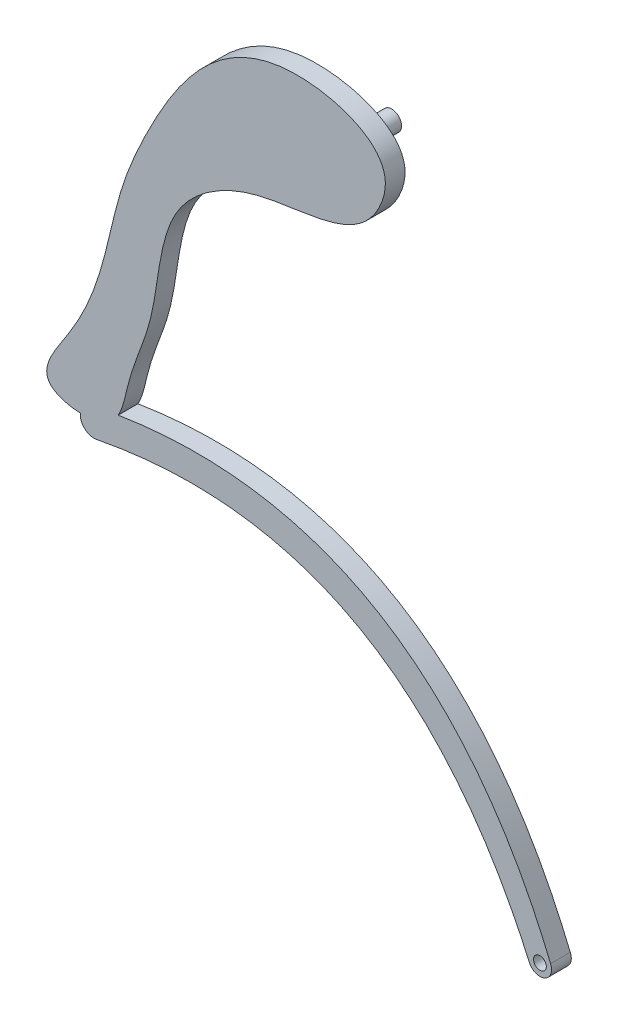
ISO-10303-21;
HEADER;
FILE_DESCRIPTION(('STEP AP214'),'2;1');
FILE_NAME('part.step','',(''),(''),'','','');
FILE_SCHEMA(('AUTOMOTIVE_DESIGN { 1 0 10303 214 1 1 1 1 }'));
ENDSEC;
DATA;
#1=APPLICATION_CONTEXT('core data for automotive mechanical design processes');
#2=APPLICATION_PROTOCOL_DEFINITION('international standard','automotive_design',2000,#1);
#3=PRODUCT_CONTEXT('',#1,'mechanical');
#4=PRODUCT('Part','Part','',(#3));
#5=PRODUCT_RELATED_PRODUCT_CATEGORY('part','',(#4));
#6=PRODUCT_DEFINITION_FORMATION('','',#4);
#7=PRODUCT_DEFINITION_CONTEXT('part definition',#1,'design');
#8=PRODUCT_DEFINITION('design','',#6,#7);
#9=PRODUCT_DEFINITION_SHAPE('','',#8);
#10=(LENGTH_UNIT() NAMED_UNIT(*) SI_UNIT(.MILLI.,.METRE.));
#11=(NAMED_UNIT(*) PLANE_ANGLE_UNIT() SI_UNIT($,.RADIAN.));
#12=(NAMED_UNIT(*) SI_UNIT($,.STERADIAN.) SOLID_ANGLE_UNIT());
#13=UNCERTAINTY_MEASURE_WITH_UNIT(LENGTH_MEASURE(1.E-05),#10,'distance_accuracy_value','');
#14=(GEOMETRIC_REPRESENTATION_CONTEXT(3) GLOBAL_UNCERTAINTY_ASSIGNED_CONTEXT((#13)) GLOBAL_UNIT_ASSIGNED_CONTEXT((#10,
#11,#12)) REPRESENTATION_CONTEXT('',''));
#15=CARTESIAN_POINT('',(0.,0.,0.));
#16=DIRECTION('',(0.,0.,1.));
#17=DIRECTION('',(1.,0.,0.));
#18=AXIS2_PLACEMENT_3D('',#15,#16,#17);
#19=CARTESIAN_POINT('',(-342.104002749214,136.783818050097,7.48502011703777));
#20=CARTESIAN_POINT('',(-342.805579458577,136.735017879965,7.48502011703777));
#21=CARTESIAN_POINT('',(-343.350555461004,135.936154868596,7.48502011703777));
#22=CARTESIAN_POINT('',(-343.929440164469,134.651457769446,7.48502011703777));
#23=CARTESIAN_POINT('',(-343.959922184164,133.777952281904,7.48502011703777));
#24=CARTESIAN_POINT('',(-344.782327143898,132.73901267866,7.48502011703777));
#25=CARTESIAN_POINT('',(-343.813368996402,132.639933395947,7.48502011703777));
#26=CARTESIAN_POINT('',(-343.727540206947,133.310775924254,7.48502011703777));
#27=CARTESIAN_POINT('',(-343.400926719451,133.968060059399,7.48502011703777));
#28=CARTESIAN_POINT('',(-343.424769057702,134.992162386568,7.48502011703777));
#29=CARTESIAN_POINT('',(-342.396848795902,135.684316393713,7.48502011703777));
#30=CARTESIAN_POINT('',(-341.342866284186,135.559973064465,7.48502011703777));
#31=CARTESIAN_POINT('',(-340.941154326409,136.591582614292,7.48502011703777));
#32=CARTESIAN_POINT('',(-341.679360406377,136.813355260069,7.48502011703777));
#33=CARTESIAN_POINT('',(-342.104002749214,136.783818050097,7.48502011703777));
#34=B_SPLINE_CURVE_WITH_KNOTS('',3,(#19,#20,#21,#22,#23,#24,#25,#26,#27,#28,#29,#30,#31,#32,
#33),.UNSPECIFIED.,.T.,.F.,(4,1,1,1,1,1,1,1,1,1,1,1,4),(0.,0.159177830000064,0.222571778534528,
0.367294655292266,0.418107249673309,0.471783736478388,0.513301840180607,0.572978205833702,
0.671765174880242,0.755128356265424,0.868017243335042,0.90365465991559,1.),.UNSPECIFIED.);
#35=DIRECTION('',(0.,0.,-1.));
#36=VECTOR('',#35,1.);
#37=SURFACE_OF_LINEAR_EXTRUSION('',#34,#36);
#38=DIRECTION('',(0.,0.,1.));
#39=VECTOR('',#38,1.);
#40=CARTESIAN_POINT('',(-343.821376877826,132.888231800464,7.38502011703777));
#41=LINE('',#40,#39);
#42=CARTESIAN_POINT('',(-343.821376877866,132.888231800457,7.28502011703778));
#43=VERTEX_POINT('',#42);
#44=CARTESIAN_POINT('',(-343.821376877866,132.888231800457,7.48502011703777));
#45=VERTEX_POINT('',#44);
#46=EDGE_CURVE('E61',#43,#45,#41,.T.);
#47=ORIENTED_EDGE('',*,*,#46,.F.);
#48=CARTESIAN_POINT('',(-342.104002749214,136.783818050097,7.28502011703778));
#49=CARTESIAN_POINT('',(-342.805579458577,136.735017879965,7.28502011703778));
#50=CARTESIAN_POINT('',(-343.350555461004,135.936154868596,7.28502011703778));
#51=CARTESIAN_POINT('',(-343.929440164469,134.651457769446,7.28502011703778));
#52=CARTESIAN_POINT('',(-343.959922184164,133.777952281904,7.28502011703778));
#53=CARTESIAN_POINT('',(-344.782327143898,132.73901267866,7.28502011703778));
#54=CARTESIAN_POINT('',(-343.813368996402,132.639933395947,7.28502011703778));
#55=CARTESIAN_POINT('',(-343.727540206947,133.310775924254,7.28502011703778));
#56=CARTESIAN_POINT('',(-343.400926719451,133.968060059399,7.28502011703778));
#57=CARTESIAN_POINT('',(-343.424769057702,134.992162386568,7.28502011703778));
#58=CARTESIAN_POINT('',(-342.396848795902,135.684316393713,7.28502011703778));
#59=CARTESIAN_POINT('',(-341.342866284186,135.559973064465,7.28502011703778));
#60=CARTESIAN_POINT('',(-340.941154326409,136.591582614292,7.28502011703778));
#61=CARTESIAN_POINT('',(-341.679360406377,136.813355260069,7.28502011703778));
#62=CARTESIAN_POINT('',(-342.104002749214,136.783818050097,7.28502011703778));
#63=B_SPLINE_CURVE_WITH_KNOTS('',3,(#48,#49,#50,#51,#52,#53,#54,#55,#56,#57,#58,#59,#60,#61,
#62),.UNSPECIFIED.,.T.,.F.,(4,1,1,1,1,1,1,1,1,1,1,1,4),(0.,0.159177830000064,0.222571778534528,
0.367294655292266,0.418107249673309,0.471783736478388,0.513301840180607,0.572978205833702,
0.671765174880242,0.755128356265424,0.868017243335042,0.90365465991559,1.),.UNSPECIFIED.);
#64=CARTESIAN_POINT('',(-344.205785310443,132.714431609231,7.28502011703778));
#65=VERTEX_POINT('',#64);
#66=EDGE_CURVE('E180',#43,#65,#63,.T.);
#67=ORIENTED_EDGE('',*,*,#66,.T.);
#68=DIRECTION('',(0.,0.,-1.));
#69=VECTOR('',#68,1.);
#70=CARTESIAN_POINT('',(-344.205785310443,132.714431609231,7.48502011703777));
#71=LINE('',#70,#69);
#72=CARTESIAN_POINT('',(-344.205785310443,132.714431609231,7.48502011703777));
#73=VERTEX_POINT('',#72);
#74=EDGE_CURVE('E133',#65,#73,#71,.F.);
#75=ORIENTED_EDGE('',*,*,#74,.T.);
#76=EDGE_CURVE('E46',#45,#73,#34,.T.);
#77=ORIENTED_EDGE('',*,*,#76,.F.);
#78=EDGE_LOOP('',(#47,#67,#75,#77));
#79=FACE_BOUND('',#78,.T.);
#80=ADVANCED_FACE('F37',(#79),#37,.F.);
#81=CARTESIAN_POINT('',(-343.757571402426,133.056662154668,7.48502011703777));
#82=DIRECTION('',(0.,0.,-1.));
#83=DIRECTION('',(-1.,0.,0.));
#84=AXIS2_PLACEMENT_3D('',#81,#82,#83);
#85=PLANE('',#84);
#86=CARTESIAN_POINT('',(-339.539284354937,130.211686137803,7.48502011703777));
#87=DIRECTION('',(0.,0.,1.));
#88=DIRECTION('',(1.,0.,0.));
#89=AXIS2_PLACEMENT_3D('',#86,#87,#88);
#90=CIRCLE('',#89,0.0648024293380558);
#91=CARTESIAN_POINT('',(-339.474481925599,130.211686137803,7.48502011703777));
#92=VERTEX_POINT('',#91);
#93=EDGE_CURVE('E203',#92,#92,#90,.T.);
#94=ORIENTED_EDGE('',*,*,#93,.F.);
#95=EDGE_LOOP('',(#94));
#96=FACE_BOUND('',#95,.T.);
#97=ORIENTED_EDGE('',*,*,#76,.T.);
#98=CARTESIAN_POINT('',(-344.066915578554,132.701169319651,7.48502011703777));
#99=DIRECTION('',(0.,0.,1.));
#100=DIRECTION('',(1.,0.,0.));
#101=AXIS2_PLACEMENT_3D('',#98,#99,#100);
#102=CIRCLE('',#101,0.139501579775661);
#103=CARTESIAN_POINT('',(-344.038536425968,132.564584860585,7.48502011703777));
#104=VERTEX_POINT('',#103);
#105=EDGE_CURVE('E53',#73,#104,#102,.T.);
#106=ORIENTED_EDGE('',*,*,#105,.T.);
#107=CARTESIAN_POINT('',(-344.038536425968,132.564584860585,7.48502011703777));
#108=CARTESIAN_POINT('',(-341.996789547392,132.960949860655,7.48502011703777));
#109=CARTESIAN_POINT('',(-340.533121693645,132.160648743439,7.48502011703777));
#110=CARTESIAN_POINT('',(-339.647532864715,130.163681508908,7.48502011703777));
#111=B_SPLINE_CURVE_WITH_KNOTS('',3,(#107,#108,#109,#110),.UNSPECIFIED.,.F.,.F.,(4,4),(0.,
0.973375657681869),.UNSPECIFIED.);
#112=CARTESIAN_POINT('',(-339.647532864715,130.163681508908,7.48502011703777));
#113=VERTEX_POINT('',#112);
#114=EDGE_CURVE('E112',#104,#113,#111,.T.);
#115=ORIENTED_EDGE('',*,*,#114,.T.);
#116=CARTESIAN_POINT('',(-339.539284354937,130.211686137803,7.48502011703777));
#117=DIRECTION('',(0.,0.,1.));
#118=DIRECTION('',(1.,0.,0.));
#119=AXIS2_PLACEMENT_3D('',#116,#117,#118);
#120=CIRCLE('',#119,0.118415304181697);
#121=CARTESIAN_POINT('',(-339.431035845159,130.259690766698,7.48502011703777));
#122=VERTEX_POINT('',#121);
#123=EDGE_CURVE('E104',#113,#122,#120,.T.);
#124=ORIENTED_EDGE('',*,*,#123,.T.);
#125=CARTESIAN_POINT('',(-344.095294731139,132.837753778718,7.48502011703777));
#126=CARTESIAN_POINT('',(-341.932162729999,133.287203544397,7.48502011703777));
#127=CARTESIAN_POINT('',(-340.331358608681,132.44262208393,7.48502011703777));
#128=CARTESIAN_POINT('',(-339.431035845159,130.259690766698,7.48502011703777));
#129=B_SPLINE_CURVE_WITH_KNOTS('',3,(#125,#126,#127,#128),.UNSPECIFIED.,.F.,.F.,(4,4),(0.,1.),.UNSPECIFIED.);
#130=EDGE_CURVE('E124',#45,#122,#129,.T.);
#131=ORIENTED_EDGE('',*,*,#130,.F.);
#132=EDGE_LOOP('',(#97,#106,#115,#124,#131));
#133=FACE_BOUND('',#132,.T.);
#134=ADVANCED_FACE('F165',(#96,#133),#85,.F.);
#135=CARTESIAN_POINT('',(-343.757571402426,133.056662154668,7.28502011703778));
#136=DIRECTION('',(0.,0.,-1.));
#137=DIRECTION('',(-1.,0.,0.));
#138=AXIS2_PLACEMENT_3D('',#135,#136,#137);
#139=PLANE('',#138);
#140=CARTESIAN_POINT('',(-339.539284354937,130.211686137803,7.28502011703778));
#141=DIRECTION('',(0.,0.,-1.));
#142=DIRECTION('',(-1.,0.,0.));
#143=AXIS2_PLACEMENT_3D('',#140,#141,#142);
#144=CIRCLE('',#143,0.0648024293380558);
#145=CARTESIAN_POINT('',(-339.604086784275,130.211686137803,7.28502011703778));
#146=VERTEX_POINT('',#145);
#147=EDGE_CURVE('E41',#146,#146,#144,.T.);
#148=ORIENTED_EDGE('',*,*,#147,.F.);
#149=EDGE_LOOP('',(#148));
#150=FACE_BOUND('',#149,.T.);
#151=ORIENTED_EDGE('',*,*,#66,.F.);
#152=CARTESIAN_POINT('',(-344.095294731139,132.837753778718,7.28502011703778));
#153=CARTESIAN_POINT('',(-341.932162729999,133.287203544397,7.28502011703778));
#154=CARTESIAN_POINT('',(-340.331358608681,132.44262208393,7.28502011703778));
#155=CARTESIAN_POINT('',(-339.431035845159,130.259690766698,7.28502011703778));
#156=B_SPLINE_CURVE_WITH_KNOTS('',3,(#152,#153,#154,#155),.UNSPECIFIED.,.F.,.F.,(4,4),(0.,1.),.UNSPECIFIED.);
#157=CARTESIAN_POINT('',(-339.431035845159,130.259690766698,7.28502011703778));
#158=VERTEX_POINT('',#157);
#159=EDGE_CURVE('E94',#43,#158,#156,.T.);
#160=ORIENTED_EDGE('',*,*,#159,.T.);
#161=CARTESIAN_POINT('',(-339.539284354937,130.211686137803,7.28502011703778));
#162=DIRECTION('',(0.,0.,-1.));
#163=DIRECTION('',(-1.,0.,0.));
#164=AXIS2_PLACEMENT_3D('',#161,#162,#163);
#165=CIRCLE('',#164,0.118415304181697);
#166=CARTESIAN_POINT('',(-339.647532864715,130.163681508908,7.28502011703778));
#167=VERTEX_POINT('',#166);
#168=EDGE_CURVE('E85',#167,#158,#165,.F.);
#169=ORIENTED_EDGE('',*,*,#168,.F.);
#170=CARTESIAN_POINT('',(-344.038536425968,132.564584860585,7.28502011703778));
#171=CARTESIAN_POINT('',(-341.996789547392,132.960949860655,7.28502011703778));
#172=CARTESIAN_POINT('',(-340.533121693645,132.160648743439,7.28502011703778));
#173=CARTESIAN_POINT('',(-339.647532864715,130.163681508908,7.28502011703778));
#174=B_SPLINE_CURVE_WITH_KNOTS('',3,(#170,#171,#172,#173),.UNSPECIFIED.,.F.,.F.,(4,4),(0.,
0.973375657681869),.UNSPECIFIED.);
#175=CARTESIAN_POINT('',(-344.038536425968,132.564584860585,7.28502011703778));
#176=VERTEX_POINT('',#175);
#177=EDGE_CURVE('E92',#176,#167,#174,.T.);
#178=ORIENTED_EDGE('',*,*,#177,.F.);
#179=CARTESIAN_POINT('',(-344.066915578554,132.701169319651,7.28502011703778));
#180=DIRECTION('',(0.,0.,-1.));
#181=DIRECTION('',(-1.,0.,0.));
#182=AXIS2_PLACEMENT_3D('',#179,#180,#181);
#183=CIRCLE('',#182,0.139501579775661);
#184=EDGE_CURVE('E119',#65,#176,#183,.F.);
#185=ORIENTED_EDGE('',*,*,#184,.F.);
#186=EDGE_LOOP('',(#151,#160,#169,#178,#185));
#187=FACE_BOUND('',#186,.T.);
#188=CARTESIAN_POINT('',(-341.644124250281,136.268917829933,7.28502011703778));
#189=DIRECTION('',(0.,0.,-1.));
#190=DIRECTION('',(-1.,0.,0.));
#191=AXIS2_PLACEMENT_3D('',#188,#189,#190);
#192=CIRCLE('',#191,0.100000000000001);
#193=CARTESIAN_POINT('',(-341.744124250281,136.268917829933,7.28502011703778));
#194=VERTEX_POINT('',#193);
#195=EDGE_CURVE('E11',#194,#194,#192,.T.);
#196=ORIENTED_EDGE('',*,*,#195,.F.);
#197=EDGE_LOOP('',(#196));
#198=FACE_BOUND('',#197,.T.);
#199=ADVANCED_FACE('F88',(#150,#187,#198),#139,.T.);
#200=CARTESIAN_POINT('',(-341.644124250281,136.268917829933,6.88502011703778));
#201=DIRECTION('',(0.,0.,1.));
#202=DIRECTION('',(1.,0.,0.));
#203=AXIS2_PLACEMENT_3D('',#200,#201,#202);
#204=CYLINDRICAL_SURFACE('',#203,0.100000000000001);
#205=CARTESIAN_POINT('',(-341.644124250281,136.268917829933,6.88502011703778));
#206=DIRECTION('',(0.,0.,1.));
#207=DIRECTION('',(1.,0.,0.));
#208=AXIS2_PLACEMENT_3D('',#205,#206,#207);
#209=CIRCLE('',#208,0.100000000000001);
#210=CARTESIAN_POINT('',(-341.544124250281,136.268917829933,6.88502011703778));
#211=VERTEX_POINT('',#210);
#212=EDGE_CURVE('E182',#211,#211,#209,.T.);
#213=ORIENTED_EDGE('',*,*,#212,.T.);
#214=EDGE_LOOP('',(#213));
#215=FACE_BOUND('',#214,.T.);
#216=ORIENTED_EDGE('',*,*,#195,.T.);
#217=EDGE_LOOP('',(#216));
#218=FACE_BOUND('',#217,.T.);
#219=ADVANCED_FACE('F160',(#215,#218),#204,.T.);
#220=CARTESIAN_POINT('',(-341.644124250281,136.268917829933,6.88502011703778));
#221=DIRECTION('',(0.,0.,1.));
#222=DIRECTION('',(1.,0.,0.));
#223=AXIS2_PLACEMENT_3D('',#220,#221,#222);
#224=PLANE('',#223);
#225=ORIENTED_EDGE('',*,*,#212,.F.);
#226=EDGE_LOOP('',(#225));
#227=FACE_BOUND('',#226,.T.);
#228=ADVANCED_FACE('F151',(#227),#224,.F.);
#229=CARTESIAN_POINT('',(-344.095294731139,132.837753778718,1.65317620803424));
#230=CARTESIAN_POINT('',(-341.932162729999,133.287203544397,1.65317620803424));
#231=CARTESIAN_POINT('',(-340.331358608681,132.44262208393,1.65317620803424));
#232=CARTESIAN_POINT('',(-339.431035845159,130.259690766698,1.65317620803424));
#233=B_SPLINE_CURVE_WITH_KNOTS('',3,(#229,#230,#231,#232),.UNSPECIFIED.,.F.,.F.,(4,4),(0.,1.),.UNSPECIFIED.);
#234=DIRECTION('',(0.,0.,1.));
#235=VECTOR('',#234,1.);
#236=SURFACE_OF_LINEAR_EXTRUSION('',#233,#235);
#237=ORIENTED_EDGE('',*,*,#159,.F.);
#238=ORIENTED_EDGE('',*,*,#46,.T.);
#239=ORIENTED_EDGE('',*,*,#130,.T.);
#240=DIRECTION('',(0.,0.,1.));
#241=VECTOR('',#240,1.);
#242=CARTESIAN_POINT('',(-339.431035845159,130.259690766698,1.65317620803424));
#243=LINE('',#242,#241);
#244=EDGE_CURVE('E98',#158,#122,#243,.T.);
#245=ORIENTED_EDGE('',*,*,#244,.F.);
#246=EDGE_LOOP('',(#237,#238,#239,#245));
#247=FACE_BOUND('',#246,.T.);
#248=ADVANCED_FACE('F146',(#247),#236,.F.);
#249=CARTESIAN_POINT('',(-344.066915578554,132.701169319651,1.65317620803424));
#250=DIRECTION('',(0.,0.,1.));
#251=DIRECTION('',(1.,0.,0.));
#252=AXIS2_PLACEMENT_3D('',#249,#250,#251);
#253=CYLINDRICAL_SURFACE('',#252,0.139501579775661);
#254=ORIENTED_EDGE('',*,*,#74,.F.);
#255=ORIENTED_EDGE('',*,*,#184,.T.);
#256=DIRECTION('',(0.,0.,1.));
#257=VECTOR('',#256,1.);
#258=CARTESIAN_POINT('',(-344.038536425968,132.564584860585,1.65317620803424));
#259=LINE('',#258,#257);
#260=EDGE_CURVE('E110',#176,#104,#259,.T.);
#261=ORIENTED_EDGE('',*,*,#260,.T.);
#262=ORIENTED_EDGE('',*,*,#105,.F.);
#263=EDGE_LOOP('',(#254,#255,#261,#262));
#264=FACE_BOUND('',#263,.T.);
#265=ADVANCED_FACE('F150',(#264),#253,.T.);
#266=CARTESIAN_POINT('',(-344.038536425968,132.564584860585,1.65317620803424));
#267=CARTESIAN_POINT('',(-341.996789547392,132.960949860655,1.65317620803424));
#268=CARTESIAN_POINT('',(-340.533121693645,132.160648743439,1.65317620803424));
#269=CARTESIAN_POINT('',(-339.647532864715,130.163681508908,1.65317620803424));
#270=B_SPLINE_CURVE_WITH_KNOTS('',3,(#266,#267,#268,#269),.UNSPECIFIED.,.F.,.F.,(4,4),(0.,
0.973375657681869),.UNSPECIFIED.);
#271=DIRECTION('',(0.,0.,1.));
#272=VECTOR('',#271,1.);
#273=SURFACE_OF_LINEAR_EXTRUSION('',#270,#272);
#274=ORIENTED_EDGE('',*,*,#260,.F.);
#275=ORIENTED_EDGE('',*,*,#177,.T.);
#276=DIRECTION('',(0.,0.,1.));
#277=VECTOR('',#276,1.);
#278=CARTESIAN_POINT('',(-339.647532864715,130.163681508908,1.65317620803424));
#279=LINE('',#278,#277);
#280=EDGE_CURVE('E99',#167,#113,#279,.T.);
#281=ORIENTED_EDGE('',*,*,#280,.T.);
#282=ORIENTED_EDGE('',*,*,#114,.F.);
#283=EDGE_LOOP('',(#274,#275,#281,#282));
#284=FACE_BOUND('',#283,.T.);
#285=ADVANCED_FACE('F109',(#284),#273,.T.);
#286=CARTESIAN_POINT('',(-339.539284354937,130.211686137803,1.65317620803424));
#287=DIRECTION('',(0.,0.,1.));
#288=DIRECTION('',(1.,0.,0.));
#289=AXIS2_PLACEMENT_3D('',#286,#287,#288);
#290=CYLINDRICAL_SURFACE('',#289,0.118415304181697);
#291=ORIENTED_EDGE('',*,*,#280,.F.);
#292=ORIENTED_EDGE('',*,*,#168,.T.);
#293=ORIENTED_EDGE('',*,*,#244,.T.);
#294=ORIENTED_EDGE('',*,*,#123,.F.);
#295=EDGE_LOOP('',(#291,#292,#293,#294));
#296=FACE_BOUND('',#295,.T.);
#297=ADVANCED_FACE('F102',(#296),#290,.T.);
#298=CARTESIAN_POINT('',(-339.539284354937,130.211686137803,6.48502011703777));
#299=DIRECTION('',(0.,0.,1.));
#300=DIRECTION('',(1.,0.,0.));
#301=AXIS2_PLACEMENT_3D('',#298,#299,#300);
#302=CYLINDRICAL_SURFACE('',#301,0.0648024293380558);
#303=ORIENTED_EDGE('',*,*,#147,.T.);
#304=EDGE_LOOP('',(#303));
#305=FACE_BOUND('',#304,.T.);
#306=ORIENTED_EDGE('',*,*,#93,.T.);
#307=EDGE_LOOP('',(#306));
#308=FACE_BOUND('',#307,.T.);
#309=ADVANCED_FACE('F155',(#305,#308),#302,.F.);
#310=CLOSED_SHELL('',(#80,#134,#199,#219,#228,#248,#265,#285,#297,#309));
#311=MANIFOLD_SOLID_BREP('B2',#310);
#312=ADVANCED_BREP_SHAPE_REPRESENTATION('',(#18,#311),#14);
#313=SHAPE_DEFINITION_REPRESENTATION(#9,#312);
ENDSEC;
END-ISO-10303-21;
